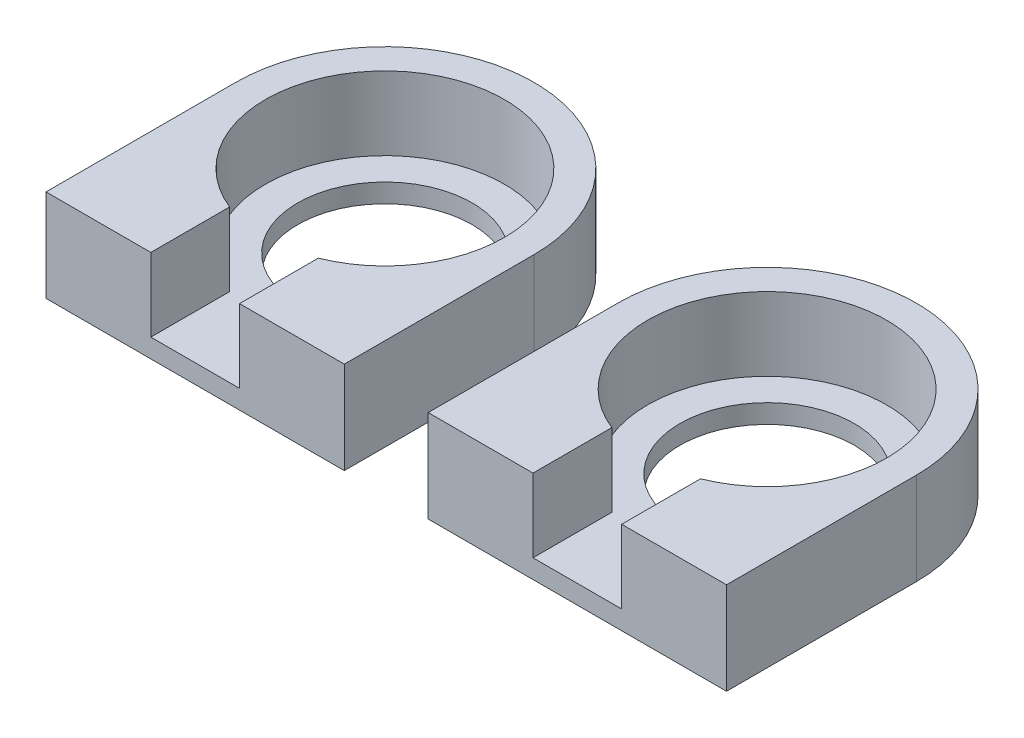
ISO-10303-21;
HEADER;
FILE_DESCRIPTION(('STEP AP214'),'2;1');
FILE_NAME('part.step','',(''),(''),'','','');
FILE_SCHEMA(('AUTOMOTIVE_DESIGN { 1 0 10303 214 1 1 1 1 }'));
ENDSEC;
DATA;
#1=APPLICATION_CONTEXT('core data for automotive mechanical design processes');
#2=APPLICATION_PROTOCOL_DEFINITION('international standard','automotive_design',2000,#1);
#3=PRODUCT_CONTEXT('',#1,'mechanical');
#4=PRODUCT('Part','Part','',(#3));
#5=PRODUCT_RELATED_PRODUCT_CATEGORY('part','',(#4));
#6=PRODUCT_DEFINITION_FORMATION('','',#4);
#7=PRODUCT_DEFINITION_CONTEXT('part definition',#1,'design');
#8=PRODUCT_DEFINITION('design','',#6,#7);
#9=PRODUCT_DEFINITION_SHAPE('','',#8);
#10=(LENGTH_UNIT() NAMED_UNIT(*) SI_UNIT(.MILLI.,.METRE.));
#11=(NAMED_UNIT(*) PLANE_ANGLE_UNIT() SI_UNIT($,.RADIAN.));
#12=(NAMED_UNIT(*) SI_UNIT($,.STERADIAN.) SOLID_ANGLE_UNIT());
#13=UNCERTAINTY_MEASURE_WITH_UNIT(LENGTH_MEASURE(1.E-05),#10,'distance_accuracy_value','');
#14=(GEOMETRIC_REPRESENTATION_CONTEXT(3) GLOBAL_UNCERTAINTY_ASSIGNED_CONTEXT((#13)) GLOBAL_UNIT_ASSIGNED_CONTEXT((#10,
#11,#12)) REPRESENTATION_CONTEXT('',''));
#15=CARTESIAN_POINT('',(0.,0.,0.));
#16=DIRECTION('',(0.,0.,1.));
#17=DIRECTION('',(1.,0.,0.));
#18=AXIS2_PLACEMENT_3D('',#15,#16,#17);
#19=CARTESIAN_POINT('',(0.,11.,0.));
#20=DIRECTION('',(0.,-1.,0.));
#21=DIRECTION('',(0.,0.,-1.));
#22=AXIS2_PLACEMENT_3D('',#19,#20,#21);
#23=CYLINDRICAL_SURFACE('',#22,14.25);
#24=DIRECTION('',(0.,-1.,0.));
#25=VECTOR('',#24,1.);
#26=CARTESIAN_POINT('',(5.2875,11.,13.2327186832487));
#27=LINE('',#26,#25);
#28=CARTESIAN_POINT('',(5.2875,11.,13.2327186832487));
#29=VERTEX_POINT('',#28);
#30=CARTESIAN_POINT('',(5.2875,2.25,13.2327186832487));
#31=VERTEX_POINT('',#30);
#32=EDGE_CURVE('E127',#29,#31,#27,.T.);
#33=ORIENTED_EDGE('',*,*,#32,.F.);
#34=CARTESIAN_POINT('',(0.,11.,0.));
#35=DIRECTION('',(0.,1.,0.));
#36=DIRECTION('',(0.,0.,1.));
#37=AXIS2_PLACEMENT_3D('',#34,#35,#36);
#38=CIRCLE('',#37,14.25);
#39=CARTESIAN_POINT('',(-5.2875,11.,13.2327186832487));
#40=VERTEX_POINT('',#39);
#41=EDGE_CURVE('E121',#29,#40,#38,.T.);
#42=ORIENTED_EDGE('',*,*,#41,.T.);
#43=DIRECTION('',(0.,-1.,0.));
#44=VECTOR('',#43,1.);
#45=CARTESIAN_POINT('',(-5.2875,11.,13.2327186832487));
#46=LINE('',#45,#44);
#47=CARTESIAN_POINT('',(-5.2875,2.25,13.2327186832487));
#48=VERTEX_POINT('',#47);
#49=EDGE_CURVE('E132',#48,#40,#46,.F.);
#50=ORIENTED_EDGE('',*,*,#49,.F.);
#51=CARTESIAN_POINT('',(0.,2.25,0.));
#52=DIRECTION('',(0.,-1.,0.));
#53=DIRECTION('',(0.,0.,-1.));
#54=AXIS2_PLACEMENT_3D('',#51,#52,#53);
#55=CIRCLE('',#54,14.25);
#56=EDGE_CURVE('E124',#48,#31,#55,.T.);
#57=ORIENTED_EDGE('',*,*,#56,.T.);
#58=EDGE_LOOP('',(#33,#42,#50,#57));
#59=FACE_BOUND('',#58,.T.);
#60=ADVANCED_FACE('F44',(#59),#23,.F.);
#61=CARTESIAN_POINT('',(0.,11.,0.));
#62=DIRECTION('',(0.,1.,0.));
#63=DIRECTION('',(0.,0.,1.));
#64=AXIS2_PLACEMENT_3D('',#61,#62,#63);
#65=PLANE('',#64);
#66=DIRECTION('',(0.,0.,-1.));
#67=VECTOR('',#66,1.);
#68=CARTESIAN_POINT('',(5.2875,11.,22.6280707264182));
#69=LINE('',#68,#67);
#70=CARTESIAN_POINT('',(5.2875,11.,22.6280707264182));
#71=VERTEX_POINT('',#70);
#72=EDGE_CURVE('E134',#71,#29,#69,.T.);
#73=ORIENTED_EDGE('',*,*,#72,.F.);
#74=DIRECTION('',(1.,0.,0.));
#75=VECTOR('',#74,1.);
#76=CARTESIAN_POINT('',(-17.7875,11.,22.6280707264182));
#77=LINE('',#76,#75);
#78=CARTESIAN_POINT('',(17.7875,11.,22.6280707264182));
#79=VERTEX_POINT('',#78);
#80=EDGE_CURVE('E114',#71,#79,#77,.T.);
#81=ORIENTED_EDGE('',*,*,#80,.T.);
#82=DIRECTION('',(0.,0.,-1.));
#83=VECTOR('',#82,1.);
#84=CARTESIAN_POINT('',(17.7875,11.,0.));
#85=LINE('',#84,#83);
#86=CARTESIAN_POINT('',(17.7875,11.,0.));
#87=VERTEX_POINT('',#86);
#88=EDGE_CURVE('E110',#79,#87,#85,.T.);
#89=ORIENTED_EDGE('',*,*,#88,.T.);
#90=CARTESIAN_POINT('',(0.,11.,0.));
#91=DIRECTION('',(0.,1.,0.));
#92=DIRECTION('',(0.,0.,1.));
#93=AXIS2_PLACEMENT_3D('',#90,#91,#92);
#94=CIRCLE('',#93,17.7875);
#95=CARTESIAN_POINT('',(-17.7875,11.,0.));
#96=VERTEX_POINT('',#95);
#97=EDGE_CURVE('E113',#87,#96,#94,.T.);
#98=ORIENTED_EDGE('',*,*,#97,.T.);
#99=DIRECTION('',(0.,0.,1.));
#100=VECTOR('',#99,1.);
#101=CARTESIAN_POINT('',(-17.7875,11.,0.));
#102=LINE('',#101,#100);
#103=CARTESIAN_POINT('',(-17.7875,11.,22.6280707264182));
#104=VERTEX_POINT('',#103);
#105=EDGE_CURVE('E116',#96,#104,#102,.T.);
#106=ORIENTED_EDGE('',*,*,#105,.T.);
#107=CARTESIAN_POINT('',(-5.2875,11.,22.6280707264182));
#108=VERTEX_POINT('',#107);
#109=EDGE_CURVE('E96',#104,#108,#77,.T.);
#110=ORIENTED_EDGE('',*,*,#109,.T.);
#111=DIRECTION('',(0.,0.,1.));
#112=VECTOR('',#111,1.);
#113=CARTESIAN_POINT('',(-5.2875,11.,10.3998125081596));
#114=LINE('',#113,#112);
#115=EDGE_CURVE('E54',#40,#108,#114,.T.);
#116=ORIENTED_EDGE('',*,*,#115,.F.);
#117=ORIENTED_EDGE('',*,*,#41,.F.);
#118=EDGE_LOOP('',(#73,#81,#89,#98,#106,#110,#116,#117));
#119=FACE_BOUND('',#118,.T.);
#120=ADVANCED_FACE('F229',(#119),#65,.T.);
#121=CARTESIAN_POINT('',(0.,11.,0.));
#122=DIRECTION('',(0.,-1.,0.));
#123=DIRECTION('',(0.,0.,-1.));
#124=AXIS2_PLACEMENT_3D('',#121,#122,#123);
#125=CYLINDRICAL_SURFACE('',#124,17.7875);
#126=CARTESIAN_POINT('',(0.,0.,0.));
#127=DIRECTION('',(0.,1.,0.));
#128=DIRECTION('',(0.,0.,1.));
#129=AXIS2_PLACEMENT_3D('',#126,#127,#128);
#130=CIRCLE('',#129,17.7875);
#131=CARTESIAN_POINT('',(17.7875,0.,0.));
#132=VERTEX_POINT('',#131);
#133=CARTESIAN_POINT('',(-17.7875,0.,0.));
#134=VERTEX_POINT('',#133);
#135=EDGE_CURVE('E62',#132,#134,#130,.T.);
#136=ORIENTED_EDGE('',*,*,#135,.T.);
#137=DIRECTION('',(0.,-1.,0.));
#138=VECTOR('',#137,1.);
#139=CARTESIAN_POINT('',(-17.7875,11.,0.));
#140=LINE('',#139,#138);
#141=EDGE_CURVE('E90',#96,#134,#140,.T.);
#142=ORIENTED_EDGE('',*,*,#141,.F.);
#143=ORIENTED_EDGE('',*,*,#97,.F.);
#144=DIRECTION('',(0.,-1.,0.));
#145=VECTOR('',#144,1.);
#146=CARTESIAN_POINT('',(17.7875,11.,0.));
#147=LINE('',#146,#145);
#148=EDGE_CURVE('E105',#87,#132,#147,.T.);
#149=ORIENTED_EDGE('',*,*,#148,.T.);
#150=EDGE_LOOP('',(#136,#142,#143,#149));
#151=FACE_BOUND('',#150,.T.);
#152=ADVANCED_FACE('F235',(#151),#125,.T.);
#153=CARTESIAN_POINT('',(-17.7875,11.,0.));
#154=DIRECTION('',(1.,0.,0.));
#155=DIRECTION('',(0.,0.,-1.));
#156=AXIS2_PLACEMENT_3D('',#153,#154,#155);
#157=PLANE('',#156);
#158=ORIENTED_EDGE('',*,*,#141,.T.);
#159=DIRECTION('',(0.,0.,1.));
#160=VECTOR('',#159,1.);
#161=CARTESIAN_POINT('',(-17.7875,0.,-32.3719292735818));
#162=LINE('',#161,#160);
#163=CARTESIAN_POINT('',(-17.7875,0.,22.6280707264182));
#164=VERTEX_POINT('',#163);
#165=EDGE_CURVE('E48',#134,#164,#162,.T.);
#166=ORIENTED_EDGE('',*,*,#165,.T.);
#167=DIRECTION('',(0.,-1.,0.));
#168=VECTOR('',#167,1.);
#169=CARTESIAN_POINT('',(-17.7875,11.,22.6280707264182));
#170=LINE('',#169,#168);
#171=EDGE_CURVE('E81',#104,#164,#170,.T.);
#172=ORIENTED_EDGE('',*,*,#171,.F.);
#173=ORIENTED_EDGE('',*,*,#105,.F.);
#174=EDGE_LOOP('',(#158,#166,#172,#173));
#175=FACE_BOUND('',#174,.T.);
#176=ADVANCED_FACE('F85',(#175),#157,.F.);
#177=CARTESIAN_POINT('',(-17.7875,11.,22.6280707264182));
#178=DIRECTION('',(0.,0.,-1.));
#179=DIRECTION('',(-1.,0.,0.));
#180=AXIS2_PLACEMENT_3D('',#177,#178,#179);
#181=PLANE('',#180);
#182=ORIENTED_EDGE('',*,*,#80,.F.);
#183=DIRECTION('',(0.,1.,0.));
#184=VECTOR('',#183,1.);
#185=CARTESIAN_POINT('',(5.2875,2.25,22.6280707264182));
#186=LINE('',#185,#184);
#187=CARTESIAN_POINT('',(5.2875,2.25,22.6280707264182));
#188=VERTEX_POINT('',#187);
#189=EDGE_CURVE('E130',#188,#71,#186,.T.);
#190=ORIENTED_EDGE('',*,*,#189,.F.);
#191=DIRECTION('',(1.,0.,0.));
#192=VECTOR('',#191,1.);
#193=CARTESIAN_POINT('',(-5.2875,2.25,22.6280707264182));
#194=LINE('',#193,#192);
#195=CARTESIAN_POINT('',(-5.2875,2.25,22.6280707264182));
#196=VERTEX_POINT('',#195);
#197=EDGE_CURVE('E142',#196,#188,#194,.T.);
#198=ORIENTED_EDGE('',*,*,#197,.F.);
#199=DIRECTION('',(0.,1.,0.));
#200=VECTOR('',#199,1.);
#201=CARTESIAN_POINT('',(-5.2875,2.25,22.6280707264182));
#202=LINE('',#201,#200);
#203=EDGE_CURVE('E91',#196,#108,#202,.T.);
#204=ORIENTED_EDGE('',*,*,#203,.T.);
#205=ORIENTED_EDGE('',*,*,#109,.F.);
#206=ORIENTED_EDGE('',*,*,#171,.T.);
#207=DIRECTION('',(1.,0.,0.));
#208=VECTOR('',#207,1.);
#209=CARTESIAN_POINT('',(-17.7875,0.,22.6280707264182));
#210=LINE('',#209,#208);
#211=CARTESIAN_POINT('',(17.7875,0.,22.6280707264182));
#212=VERTEX_POINT('',#211);
#213=EDGE_CURVE('E73',#164,#212,#210,.T.);
#214=ORIENTED_EDGE('',*,*,#213,.T.);
#215=DIRECTION('',(0.,-1.,0.));
#216=VECTOR('',#215,1.);
#217=CARTESIAN_POINT('',(17.7875,11.,22.6280707264182));
#218=LINE('',#217,#216);
#219=EDGE_CURVE('E102',#79,#212,#218,.T.);
#220=ORIENTED_EDGE('',*,*,#219,.F.);
#221=EDGE_LOOP('',(#182,#190,#198,#204,#205,#206,#214,#220));
#222=FACE_BOUND('',#221,.T.);
#223=ADVANCED_FACE('F93',(#222),#181,.F.);
#224=CARTESIAN_POINT('',(17.7875,11.,0.));
#225=DIRECTION('',(-1.,0.,0.));
#226=DIRECTION('',(0.,0.,1.));
#227=AXIS2_PLACEMENT_3D('',#224,#225,#226);
#228=PLANE('',#227);
#229=DIRECTION('',(0.,0.,-1.));
#230=VECTOR('',#229,1.);
#231=CARTESIAN_POINT('',(17.7875,0.,0.));
#232=LINE('',#231,#230);
#233=EDGE_CURVE('E76',#212,#132,#232,.T.);
#234=ORIENTED_EDGE('',*,*,#233,.T.);
#235=ORIENTED_EDGE('',*,*,#148,.F.);
#236=ORIENTED_EDGE('',*,*,#88,.F.);
#237=ORIENTED_EDGE('',*,*,#219,.T.);
#238=EDGE_LOOP('',(#234,#235,#236,#237));
#239=FACE_BOUND('',#238,.T.);
#240=ADVANCED_FACE('F179',(#239),#228,.F.);
#241=CARTESIAN_POINT('',(0.,2.25,0.));
#242=DIRECTION('',(0.,-1.,0.));
#243=DIRECTION('',(0.,0.,-1.));
#244=AXIS2_PLACEMENT_3D('',#241,#242,#243);
#245=PLANE('',#244);
#246=ORIENTED_EDGE('',*,*,#56,.F.);
#247=DIRECTION('',(0.,0.,1.));
#248=VECTOR('',#247,1.);
#249=CARTESIAN_POINT('',(-5.2875,2.25,10.3998125081596));
#250=LINE('',#249,#248);
#251=EDGE_CURVE('E104',#48,#196,#250,.T.);
#252=ORIENTED_EDGE('',*,*,#251,.T.);
#253=ORIENTED_EDGE('',*,*,#197,.T.);
#254=DIRECTION('',(0.,0.,-1.));
#255=VECTOR('',#254,1.);
#256=CARTESIAN_POINT('',(5.2875,2.25,22.6280707264182));
#257=LINE('',#256,#255);
#258=EDGE_CURVE('E145',#188,#31,#257,.T.);
#259=ORIENTED_EDGE('',*,*,#258,.T.);
#260=EDGE_LOOP('',(#246,#252,#253,#259));
#261=FACE_BOUND('',#260,.T.);
#262=CARTESIAN_POINT('',(0.,2.25,0.));
#263=DIRECTION('',(0.,1.,0.));
#264=DIRECTION('',(-0.00600464804505152,0.,0.999981971938422));
#265=AXIS2_PLACEMENT_3D('',#262,#263,#264);
#266=CIRCLE('',#265,10.4);
#267=CARTESIAN_POINT('',(-0.0624483396685354,2.25,10.3998125081596));
#268=VERTEX_POINT('',#267);
#269=CARTESIAN_POINT('',(0.0624483396685354,2.25,10.3998125081596));
#270=VERTEX_POINT('',#269);
#271=EDGE_CURVE('E131',#268,#270,#266,.T.);
#272=ORIENTED_EDGE('',*,*,#271,.F.);
#273=CARTESIAN_POINT('',(0.,2.25,0.));
#274=DIRECTION('',(0.,1.,0.));
#275=DIRECTION('',(0.,0.,1.));
#276=AXIS2_PLACEMENT_3D('',#273,#274,#275);
#277=CIRCLE('',#276,10.4);
#278=EDGE_CURVE('E148',#270,#268,#277,.T.);
#279=ORIENTED_EDGE('',*,*,#278,.F.);
#280=EDGE_LOOP('',(#272,#279));
#281=FACE_BOUND('',#280,.T.);
#282=ADVANCED_FACE('F168',(#261,#281),#245,.F.);
#283=CARTESIAN_POINT('',(0.,0.,0.));
#284=DIRECTION('',(0.,1.,0.));
#285=DIRECTION('',(0.,0.,1.));
#286=AXIS2_PLACEMENT_3D('',#283,#284,#285);
#287=CYLINDRICAL_SURFACE('',#286,10.4);
#288=CARTESIAN_POINT('',(0.,0.,0.));
#289=DIRECTION('',(0.,1.,0.));
#290=DIRECTION('',(0.,0.,1.));
#291=AXIS2_PLACEMENT_3D('',#288,#289,#290);
#292=CIRCLE('',#291,10.4);
#293=CARTESIAN_POINT('',(0.,0.,10.4));
#294=VERTEX_POINT('',#293);
#295=EDGE_CURVE('E12',#294,#294,#292,.T.);
#296=ORIENTED_EDGE('',*,*,#295,.F.);
#297=EDGE_LOOP('',(#296));
#298=FACE_BOUND('',#297,.T.);
#299=ORIENTED_EDGE('',*,*,#278,.T.);
#300=ORIENTED_EDGE('',*,*,#271,.T.);
#301=EDGE_LOOP('',(#299,#300));
#302=FACE_BOUND('',#301,.T.);
#303=ADVANCED_FACE('F178',(#298,#302),#287,.F.);
#304=CARTESIAN_POINT('',(5.2875,2.25,22.6280707264182));
#305=DIRECTION('',(1.,0.,0.));
#306=DIRECTION('',(0.,0.,-1.));
#307=AXIS2_PLACEMENT_3D('',#304,#305,#306);
#308=PLANE('',#307);
#309=ORIENTED_EDGE('',*,*,#32,.T.);
#310=ORIENTED_EDGE('',*,*,#258,.F.);
#311=ORIENTED_EDGE('',*,*,#189,.T.);
#312=ORIENTED_EDGE('',*,*,#72,.T.);
#313=EDGE_LOOP('',(#309,#310,#311,#312));
#314=FACE_BOUND('',#313,.T.);
#315=ADVANCED_FACE('F184',(#314),#308,.F.);
#316=CARTESIAN_POINT('',(-5.2875,2.25,10.3998125081596));
#317=DIRECTION('',(-1.,0.,0.));
#318=DIRECTION('',(0.,0.,1.));
#319=AXIS2_PLACEMENT_3D('',#316,#317,#318);
#320=PLANE('',#319);
#321=ORIENTED_EDGE('',*,*,#49,.T.);
#322=ORIENTED_EDGE('',*,*,#115,.T.);
#323=ORIENTED_EDGE('',*,*,#203,.F.);
#324=ORIENTED_EDGE('',*,*,#251,.F.);
#325=EDGE_LOOP('',(#321,#322,#323,#324));
#326=FACE_BOUND('',#325,.T.);
#327=ADVANCED_FACE('F220',(#326),#320,.F.);
#328=CARTESIAN_POINT('',(63.3625,0.,-32.3719292735818));
#329=DIRECTION('',(0.,1.,0.));
#330=DIRECTION('',(0.,0.,1.));
#331=AXIS2_PLACEMENT_3D('',#328,#329,#330);
#332=PLANE('',#331);
#333=ORIENTED_EDGE('',*,*,#295,.T.);
#334=EDGE_LOOP('',(#333));
#335=FACE_BOUND('',#334,.T.);
#336=ORIENTED_EDGE('',*,*,#233,.F.);
#337=ORIENTED_EDGE('',*,*,#213,.F.);
#338=ORIENTED_EDGE('',*,*,#165,.F.);
#339=ORIENTED_EDGE('',*,*,#135,.F.);
#340=EDGE_LOOP('',(#336,#337,#338,#339));
#341=FACE_BOUND('',#340,.T.);
#342=ADVANCED_FACE('F46',(#335,#341),#332,.F.);
#343=CLOSED_SHELL('',(#60,#120,#152,#176,#223,#240,#282,#303,#315,#327,#342));
#344=MANIFOLD_SOLID_BREP('B2',#343);
#345=CARTESIAN_POINT('',(45.575,11.,0.));
#346=DIRECTION('',(0.,-1.,0.));
#347=DIRECTION('',(0.,0.,-1.));
#348=AXIS2_PLACEMENT_3D('',#345,#346,#347);
#349=CYLINDRICAL_SURFACE('',#348,14.25);
#350=DIRECTION('',(0.,-1.,0.));
#351=VECTOR('',#350,1.);
#352=CARTESIAN_POINT('',(40.2875,11.,13.2327186832487));
#353=LINE('',#352,#351);
#354=CARTESIAN_POINT('',(40.2875,11.,13.2327186832487));
#355=VERTEX_POINT('',#354);
#356=CARTESIAN_POINT('',(40.2875,2.25,13.2327186832487));
#357=VERTEX_POINT('',#356);
#358=EDGE_CURVE('E485',#355,#357,#353,.T.);
#359=ORIENTED_EDGE('',*,*,#358,.T.);
#360=CARTESIAN_POINT('',(45.575,2.25,0.));
#361=DIRECTION('',(0.,1.,0.));
#362=DIRECTION('',(0.,0.,-1.));
#363=AXIS2_PLACEMENT_3D('',#360,#361,#362);
#364=CIRCLE('',#363,14.25);
#365=CARTESIAN_POINT('',(50.8625,2.25,13.2327186832487));
#366=VERTEX_POINT('',#365);
#367=EDGE_CURVE('E482',#366,#357,#364,.T.);
#368=ORIENTED_EDGE('',*,*,#367,.F.);
#369=DIRECTION('',(0.,-1.,0.));
#370=VECTOR('',#369,1.);
#371=CARTESIAN_POINT('',(50.8625,11.,13.2327186832487));
#372=LINE('',#371,#370);
#373=CARTESIAN_POINT('',(50.8625,11.,13.2327186832487));
#374=VERTEX_POINT('',#373);
#375=EDGE_CURVE('E487',#366,#374,#372,.F.);
#376=ORIENTED_EDGE('',*,*,#375,.T.);
#377=CARTESIAN_POINT('',(45.575,11.,0.));
#378=DIRECTION('',(0.,-1.,0.));
#379=DIRECTION('',(0.,0.,1.));
#380=AXIS2_PLACEMENT_3D('',#377,#378,#379);
#381=CIRCLE('',#380,14.25);
#382=EDGE_CURVE('E409',#355,#374,#381,.T.);
#383=ORIENTED_EDGE('',*,*,#382,.F.);
#384=EDGE_LOOP('',(#359,#368,#376,#383));
#385=FACE_BOUND('',#384,.T.);
#386=ADVANCED_FACE('F326',(#385),#349,.F.);
#387=CARTESIAN_POINT('',(40.2875,2.25,22.6280707264182));
#388=DIRECTION('',(-1.,0.,0.));
#389=DIRECTION('',(0.,0.,-1.));
#390=AXIS2_PLACEMENT_3D('',#387,#388,#389);
#391=PLANE('',#390);
#392=ORIENTED_EDGE('',*,*,#358,.F.);
#393=DIRECTION('',(0.,0.,-1.));
#394=VECTOR('',#393,1.);
#395=CARTESIAN_POINT('',(40.2875,11.,22.6280707264182));
#396=LINE('',#395,#394);
#397=CARTESIAN_POINT('',(40.2875,11.,22.6280707264182));
#398=VERTEX_POINT('',#397);
#399=EDGE_CURVE('E499',#398,#355,#396,.T.);
#400=ORIENTED_EDGE('',*,*,#399,.F.);
#401=DIRECTION('',(0.,1.,0.));
#402=VECTOR('',#401,1.);
#403=CARTESIAN_POINT('',(40.2875,2.25,22.6280707264182));
#404=LINE('',#403,#402);
#405=CARTESIAN_POINT('',(40.2875,2.25,22.6280707264182));
#406=VERTEX_POINT('',#405);
#407=EDGE_CURVE('E494',#406,#398,#404,.T.);
#408=ORIENTED_EDGE('',*,*,#407,.F.);
#409=DIRECTION('',(0.,0.,-1.));
#410=VECTOR('',#409,1.);
#411=CARTESIAN_POINT('',(40.2875,2.25,22.6280707264182));
#412=LINE('',#411,#410);
#413=EDGE_CURVE('E506',#406,#357,#412,.T.);
#414=ORIENTED_EDGE('',*,*,#413,.T.);
#415=EDGE_LOOP('',(#392,#400,#408,#414));
#416=FACE_BOUND('',#415,.T.);
#417=ADVANCED_FACE('F466',(#416),#391,.F.);
#418=CARTESIAN_POINT('',(45.575,0.,0.));
#419=DIRECTION('',(0.,1.,0.));
#420=DIRECTION('',(0.,0.,1.));
#421=AXIS2_PLACEMENT_3D('',#418,#419,#420);
#422=CYLINDRICAL_SURFACE('',#421,10.4);
#423=CARTESIAN_POINT('',(45.575,0.,0.));
#424=DIRECTION('',(0.,-1.,0.));
#425=DIRECTION('',(0.,0.,1.));
#426=AXIS2_PLACEMENT_3D('',#423,#424,#425);
#427=CIRCLE('',#426,10.4);
#428=CARTESIAN_POINT('',(45.575,0.,10.4));
#429=VERTEX_POINT('',#428);
#430=EDGE_CURVE('E416',#429,#429,#427,.T.);
#431=ORIENTED_EDGE('',*,*,#430,.T.);
#432=EDGE_LOOP('',(#431));
#433=FACE_BOUND('',#432,.T.);
#434=CARTESIAN_POINT('',(45.575,2.25,0.));
#435=DIRECTION('',(0.,-1.,0.));
#436=DIRECTION('',(0.,0.,1.));
#437=AXIS2_PLACEMENT_3D('',#434,#435,#436);
#438=CIRCLE('',#437,10.4);
#439=CARTESIAN_POINT('',(45.5125516603315,2.25,10.3998125081596));
#440=VERTEX_POINT('',#439);
#441=CARTESIAN_POINT('',(45.6374483396685,2.25,10.3998125081596));
#442=VERTEX_POINT('',#441);
#443=EDGE_CURVE('E350',#440,#442,#438,.T.);
#444=ORIENTED_EDGE('',*,*,#443,.F.);
#445=CARTESIAN_POINT('',(45.6374483396685,2.25,10.3998125081596));
#446=CARTESIAN_POINT('',(45.575,2.25,10.4001874952206));
#447=CARTESIAN_POINT('',(45.5125516603315,2.25,10.3998125081596));
#448=B_SPLINE_CURVE_WITH_KNOTS('',2,(#445,#446,#447),.UNSPECIFIED.,.F.,.F.,(3,3),(0.,1.),.UNSPECIFIED.);
#449=EDGE_CURVE('E449',#442,#440,#448,.T.);
#450=ORIENTED_EDGE('',*,*,#449,.F.);
#451=EDGE_LOOP('',(#444,#450));
#452=FACE_BOUND('',#451,.T.);
#453=ADVANCED_FACE('F455',(#433,#452),#422,.F.);
#454=CARTESIAN_POINT('',(45.575,2.25,0.));
#455=DIRECTION('',(0.,-1.,0.));
#456=DIRECTION('',(0.,0.,-1.));
#457=AXIS2_PLACEMENT_3D('',#454,#455,#456);
#458=PLANE('',#457);
#459=ORIENTED_EDGE('',*,*,#367,.T.);
#460=ORIENTED_EDGE('',*,*,#413,.F.);
#461=DIRECTION('',(-1.,0.,0.));
#462=VECTOR('',#461,1.);
#463=CARTESIAN_POINT('',(50.8625,2.25,22.6280707264182));
#464=LINE('',#463,#462);
#465=CARTESIAN_POINT('',(50.8625,2.25,22.6280707264182));
#466=VERTEX_POINT('',#465);
#467=EDGE_CURVE('E512',#466,#406,#464,.T.);
#468=ORIENTED_EDGE('',*,*,#467,.F.);
#469=DIRECTION('',(0.,0.,1.));
#470=VECTOR('',#469,1.);
#471=CARTESIAN_POINT('',(50.8625,2.25,10.3998125081596));
#472=LINE('',#471,#470);
#473=EDGE_CURVE('E343',#366,#466,#472,.T.);
#474=ORIENTED_EDGE('',*,*,#473,.F.);
#475=EDGE_LOOP('',(#459,#460,#468,#474));
#476=FACE_BOUND('',#475,.T.);
#477=ORIENTED_EDGE('',*,*,#449,.T.);
#478=ORIENTED_EDGE('',*,*,#443,.T.);
#479=EDGE_LOOP('',(#477,#478));
#480=FACE_BOUND('',#479,.T.);
#481=ADVANCED_FACE('F465',(#476,#480),#458,.F.);
#482=CARTESIAN_POINT('',(50.8625,2.25,10.3998125081596));
#483=DIRECTION('',(1.,0.,0.));
#484=DIRECTION('',(0.,0.,1.));
#485=AXIS2_PLACEMENT_3D('',#482,#483,#484);
#486=PLANE('',#485);
#487=ORIENTED_EDGE('',*,*,#375,.F.);
#488=ORIENTED_EDGE('',*,*,#473,.T.);
#489=DIRECTION('',(0.,1.,0.));
#490=VECTOR('',#489,1.);
#491=CARTESIAN_POINT('',(50.8625,2.25,22.6280707264182));
#492=LINE('',#491,#490);
#493=CARTESIAN_POINT('',(50.8625,11.,22.6280707264182));
#494=VERTEX_POINT('',#493);
#495=EDGE_CURVE('E505',#466,#494,#492,.T.);
#496=ORIENTED_EDGE('',*,*,#495,.T.);
#497=DIRECTION('',(0.,0.,1.));
#498=VECTOR('',#497,1.);
#499=CARTESIAN_POINT('',(50.8625,11.,10.3998125081596));
#500=LINE('',#499,#498);
#501=EDGE_CURVE('E501',#374,#494,#500,.T.);
#502=ORIENTED_EDGE('',*,*,#501,.F.);
#503=EDGE_LOOP('',(#487,#488,#496,#502));
#504=FACE_BOUND('',#503,.T.);
#505=ADVANCED_FACE('F472',(#504),#486,.F.);
#506=CARTESIAN_POINT('',(45.575,11.,0.));
#507=DIRECTION('',(0.,1.,0.));
#508=DIRECTION('',(0.,0.,1.));
#509=AXIS2_PLACEMENT_3D('',#506,#507,#508);
#510=PLANE('',#509);
#511=ORIENTED_EDGE('',*,*,#399,.T.);
#512=ORIENTED_EDGE('',*,*,#382,.T.);
#513=ORIENTED_EDGE('',*,*,#501,.T.);
#514=DIRECTION('',(-1.,0.,0.));
#515=VECTOR('',#514,1.);
#516=CARTESIAN_POINT('',(63.3625,11.,22.6280707264182));
#517=LINE('',#516,#515);
#518=CARTESIAN_POINT('',(63.3625,11.,22.6280707264182));
#519=VERTEX_POINT('',#518);
#520=EDGE_CURVE('E431',#519,#494,#517,.T.);
#521=ORIENTED_EDGE('',*,*,#520,.F.);
#522=DIRECTION('',(0.,0.,1.));
#523=VECTOR('',#522,1.);
#524=CARTESIAN_POINT('',(63.3625,11.,0.));
#525=LINE('',#524,#523);
#526=CARTESIAN_POINT('',(63.3625,11.,0.));
#527=VERTEX_POINT('',#526);
#528=EDGE_CURVE('E425',#527,#519,#525,.T.);
#529=ORIENTED_EDGE('',*,*,#528,.F.);
#530=CARTESIAN_POINT('',(45.575,11.,0.));
#531=DIRECTION('',(0.,-1.,0.));
#532=DIRECTION('',(0.,0.,1.));
#533=AXIS2_PLACEMENT_3D('',#530,#531,#532);
#534=CIRCLE('',#533,17.7875);
#535=CARTESIAN_POINT('',(27.7875,11.,0.));
#536=VERTEX_POINT('',#535);
#537=EDGE_CURVE('E419',#536,#527,#534,.T.);
#538=ORIENTED_EDGE('',*,*,#537,.F.);
#539=DIRECTION('',(0.,0.,-1.));
#540=VECTOR('',#539,1.);
#541=CARTESIAN_POINT('',(27.7875,11.,0.));
#542=LINE('',#541,#540);
#543=CARTESIAN_POINT('',(27.7875,11.,22.6280707264182));
#544=VERTEX_POINT('',#543);
#545=EDGE_CURVE('E438',#544,#536,#542,.T.);
#546=ORIENTED_EDGE('',*,*,#545,.F.);
#547=EDGE_CURVE('E432',#398,#544,#517,.T.);
#548=ORIENTED_EDGE('',*,*,#547,.F.);
#549=EDGE_LOOP('',(#511,#512,#513,#521,#529,#538,#546,#548));
#550=FACE_BOUND('',#549,.T.);
#551=ADVANCED_FACE('F428',(#550),#510,.T.);
#552=CARTESIAN_POINT('',(27.7875,11.,0.));
#553=DIRECTION('',(1.,0.,0.));
#554=DIRECTION('',(0.,0.,1.));
#555=AXIS2_PLACEMENT_3D('',#552,#553,#554);
#556=PLANE('',#555);
#557=DIRECTION('',(0.,0.,-1.));
#558=VECTOR('',#557,1.);
#559=CARTESIAN_POINT('',(27.7875,0.,0.));
#560=LINE('',#559,#558);
#561=CARTESIAN_POINT('',(27.7875,0.,22.6280707264182));
#562=VERTEX_POINT('',#561);
#563=CARTESIAN_POINT('',(27.7875,0.,0.));
#564=VERTEX_POINT('',#563);
#565=EDGE_CURVE('E405',#562,#564,#560,.T.);
#566=ORIENTED_EDGE('',*,*,#565,.F.);
#567=DIRECTION('',(0.,-1.,0.));
#568=VECTOR('',#567,1.);
#569=CARTESIAN_POINT('',(27.7875,11.,22.6280707264182));
#570=LINE('',#569,#568);
#571=EDGE_CURVE('E443',#544,#562,#570,.T.);
#572=ORIENTED_EDGE('',*,*,#571,.F.);
#573=ORIENTED_EDGE('',*,*,#545,.T.);
#574=DIRECTION('',(0.,-1.,0.));
#575=VECTOR('',#574,1.);
#576=CARTESIAN_POINT('',(27.7875,11.,0.));
#577=LINE('',#576,#575);
#578=EDGE_CURVE('E421',#536,#564,#577,.T.);
#579=ORIENTED_EDGE('',*,*,#578,.T.);
#580=EDGE_LOOP('',(#566,#572,#573,#579));
#581=FACE_BOUND('',#580,.T.);
#582=ADVANCED_FACE('F534',(#581),#556,.F.);
#583=CARTESIAN_POINT('',(63.3625,11.,22.6280707264182));
#584=DIRECTION('',(0.,0.,-1.));
#585=DIRECTION('',(1.,0.,0.));
#586=AXIS2_PLACEMENT_3D('',#583,#584,#585);
#587=PLANE('',#586);
#588=ORIENTED_EDGE('',*,*,#547,.T.);
#589=ORIENTED_EDGE('',*,*,#571,.T.);
#590=DIRECTION('',(-1.,0.,0.));
#591=VECTOR('',#590,1.);
#592=CARTESIAN_POINT('',(63.3625,0.,22.6280707264182));
#593=LINE('',#592,#591);
#594=CARTESIAN_POINT('',(63.3625,0.,22.6280707264182));
#595=VERTEX_POINT('',#594);
#596=EDGE_CURVE('E408',#595,#562,#593,.T.);
#597=ORIENTED_EDGE('',*,*,#596,.F.);
#598=DIRECTION('',(0.,-1.,0.));
#599=VECTOR('',#598,1.);
#600=CARTESIAN_POINT('',(63.3625,11.,22.6280707264182));
#601=LINE('',#600,#599);
#602=EDGE_CURVE('E335',#519,#595,#601,.T.);
#603=ORIENTED_EDGE('',*,*,#602,.F.);
#604=ORIENTED_EDGE('',*,*,#520,.T.);
#605=ORIENTED_EDGE('',*,*,#495,.F.);
#606=ORIENTED_EDGE('',*,*,#467,.T.);
#607=ORIENTED_EDGE('',*,*,#407,.T.);
#608=EDGE_LOOP('',(#588,#589,#597,#603,#604,#605,#606,#607));
#609=FACE_BOUND('',#608,.T.);
#610=ADVANCED_FACE('F516',(#609),#587,.F.);
#611=CARTESIAN_POINT('',(63.3625,11.,0.));
#612=DIRECTION('',(-1.,0.,0.));
#613=DIRECTION('',(0.,0.,-1.));
#614=AXIS2_PLACEMENT_3D('',#611,#612,#613);
#615=PLANE('',#614);
#616=ORIENTED_EDGE('',*,*,#602,.T.);
#617=DIRECTION('',(0.,0.,1.));
#618=VECTOR('',#617,1.);
#619=CARTESIAN_POINT('',(63.3625,0.,-32.3719292735818));
#620=LINE('',#619,#618);
#621=CARTESIAN_POINT('',(63.3625,0.,0.));
#622=VERTEX_POINT('',#621);
#623=EDGE_CURVE('E402',#622,#595,#620,.T.);
#624=ORIENTED_EDGE('',*,*,#623,.F.);
#625=DIRECTION('',(0.,-1.,0.));
#626=VECTOR('',#625,1.);
#627=CARTESIAN_POINT('',(63.3625,11.,0.));
#628=LINE('',#627,#626);
#629=EDGE_CURVE('E42',#527,#622,#628,.T.);
#630=ORIENTED_EDGE('',*,*,#629,.F.);
#631=ORIENTED_EDGE('',*,*,#528,.T.);
#632=EDGE_LOOP('',(#616,#624,#630,#631));
#633=FACE_BOUND('',#632,.T.);
#634=ADVANCED_FACE('F413',(#633),#615,.F.);
#635=CARTESIAN_POINT('',(45.575,11.,0.));
#636=DIRECTION('',(0.,-1.,0.));
#637=DIRECTION('',(0.,0.,-1.));
#638=AXIS2_PLACEMENT_3D('',#635,#636,#637);
#639=CYLINDRICAL_SURFACE('',#638,17.7875);
#640=CARTESIAN_POINT('',(45.575,0.,0.));
#641=DIRECTION('',(0.,-1.,0.));
#642=DIRECTION('',(0.,0.,1.));
#643=AXIS2_PLACEMENT_3D('',#640,#641,#642);
#644=CIRCLE('',#643,17.7875);
#645=EDGE_CURVE('E398',#564,#622,#644,.T.);
#646=ORIENTED_EDGE('',*,*,#645,.F.);
#647=ORIENTED_EDGE('',*,*,#578,.F.);
#648=ORIENTED_EDGE('',*,*,#537,.T.);
#649=ORIENTED_EDGE('',*,*,#629,.T.);
#650=EDGE_LOOP('',(#646,#647,#648,#649));
#651=FACE_BOUND('',#650,.T.);
#652=ADVANCED_FACE('F328',(#651),#639,.T.);
#653=CARTESIAN_POINT('',(63.3625,0.,-32.3719292735818));
#654=DIRECTION('',(0.,1.,0.));
#655=DIRECTION('',(0.,0.,1.));
#656=AXIS2_PLACEMENT_3D('',#653,#654,#655);
#657=PLANE('',#656);
#658=ORIENTED_EDGE('',*,*,#623,.T.);
#659=ORIENTED_EDGE('',*,*,#596,.T.);
#660=ORIENTED_EDGE('',*,*,#565,.T.);
#661=ORIENTED_EDGE('',*,*,#645,.T.);
#662=EDGE_LOOP('',(#658,#659,#660,#661));
#663=FACE_BOUND('',#662,.T.);
#664=ORIENTED_EDGE('',*,*,#430,.F.);
#665=EDGE_LOOP('',(#664));
#666=FACE_BOUND('',#665,.T.);
#667=ADVANCED_FACE('F400',(#663,#666),#657,.F.);
#668=CLOSED_SHELL('',(#386,#417,#453,#481,#505,#551,#582,#610,#634,#652,#667));
#669=MANIFOLD_SOLID_BREP('B6',#668);
#670=ADVANCED_BREP_SHAPE_REPRESENTATION('',(#18,#344,#669),#14);
#671=SHAPE_DEFINITION_REPRESENTATION(#9,#670);
ENDSEC;
END-ISO-10303-21;
